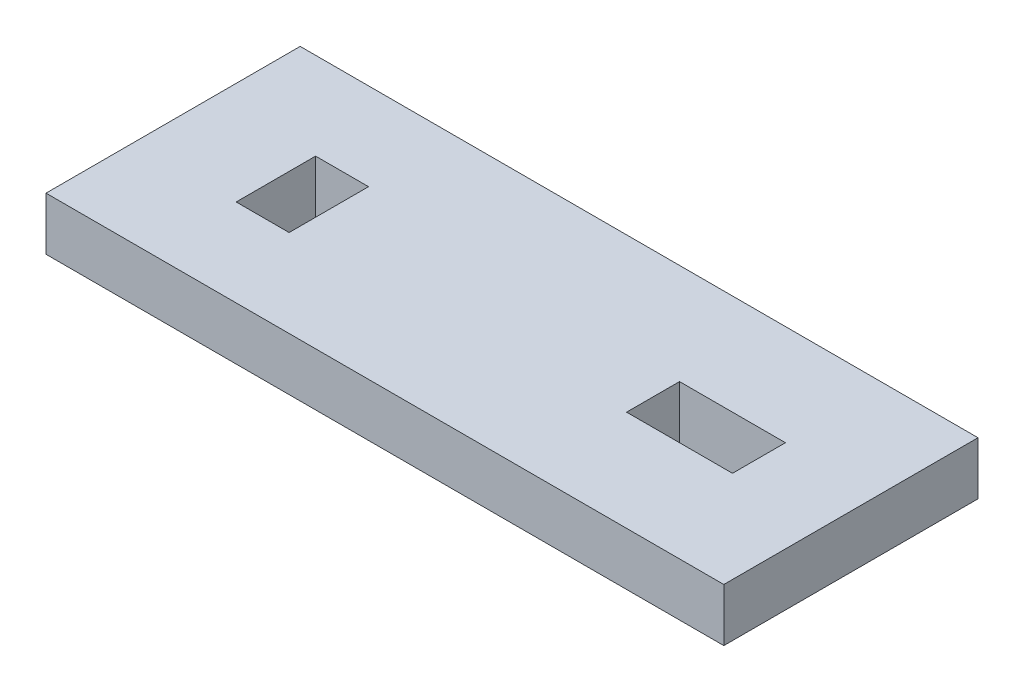
ISO-10303-21;
HEADER;
FILE_DESCRIPTION(('STEP AP214'),'2;1');
FILE_NAME('part.step','',(''),(''),'','','');
FILE_SCHEMA(('AUTOMOTIVE_DESIGN { 1 0 10303 214 1 1 1 1 }'));
ENDSEC;
DATA;
#1=APPLICATION_CONTEXT('core data for automotive mechanical design processes');
#2=APPLICATION_PROTOCOL_DEFINITION('international standard','automotive_design',2000,#1);
#3=PRODUCT_CONTEXT('',#1,'mechanical');
#4=PRODUCT('Part','Part','',(#3));
#5=PRODUCT_RELATED_PRODUCT_CATEGORY('part','',(#4));
#6=PRODUCT_DEFINITION_FORMATION('','',#4);
#7=PRODUCT_DEFINITION_CONTEXT('part definition',#1,'design');
#8=PRODUCT_DEFINITION('design','',#6,#7);
#9=PRODUCT_DEFINITION_SHAPE('','',#8);
#10=(LENGTH_UNIT() NAMED_UNIT(*) SI_UNIT(.MILLI.,.METRE.));
#11=(NAMED_UNIT(*) PLANE_ANGLE_UNIT() SI_UNIT($,.RADIAN.));
#12=(NAMED_UNIT(*) SI_UNIT($,.STERADIAN.) SOLID_ANGLE_UNIT());
#13=UNCERTAINTY_MEASURE_WITH_UNIT(LENGTH_MEASURE(1.E-05),#10,'distance_accuracy_value','');
#14=(GEOMETRIC_REPRESENTATION_CONTEXT(3) GLOBAL_UNCERTAINTY_ASSIGNED_CONTEXT((#13)) GLOBAL_UNIT_ASSIGNED_CONTEXT((#10,
#11,#12)) REPRESENTATION_CONTEXT('',''));
#15=CARTESIAN_POINT('',(0.,0.,0.));
#16=DIRECTION('',(0.,0.,1.));
#17=DIRECTION('',(1.,0.,0.));
#18=AXIS2_PLACEMENT_3D('',#15,#16,#17);
#19=CARTESIAN_POINT('',(0.,3.175,0.));
#20=DIRECTION('',(1.,0.,0.));
#21=DIRECTION('',(0.,0.,-1.));
#22=AXIS2_PLACEMENT_3D('',#19,#20,#21);
#23=PLANE('',#22);
#24=DIRECTION('',(0.,0.,1.));
#25=VECTOR('',#24,1.);
#26=CARTESIAN_POINT('',(0.,0.,0.));
#27=LINE('',#26,#25);
#28=CARTESIAN_POINT('',(0.,0.,-15.24));
#29=VERTEX_POINT('',#28);
#30=CARTESIAN_POINT('',(0.,0.,0.));
#31=VERTEX_POINT('',#30);
#32=EDGE_CURVE('E175',#29,#31,#27,.T.);
#33=ORIENTED_EDGE('',*,*,#32,.T.);
#34=DIRECTION('',(0.,-1.,0.));
#35=VECTOR('',#34,1.);
#36=CARTESIAN_POINT('',(0.,3.175,0.));
#37=LINE('',#36,#35);
#38=CARTESIAN_POINT('',(0.,3.175,0.));
#39=VERTEX_POINT('',#38);
#40=EDGE_CURVE('E11',#39,#31,#37,.T.);
#41=ORIENTED_EDGE('',*,*,#40,.F.);
#42=DIRECTION('',(0.,0.,1.));
#43=VECTOR('',#42,1.);
#44=CARTESIAN_POINT('',(0.,3.175,0.));
#45=LINE('',#44,#43);
#46=CARTESIAN_POINT('',(0.,3.175,-15.24));
#47=VERTEX_POINT('',#46);
#48=EDGE_CURVE('E222',#47,#39,#45,.T.);
#49=ORIENTED_EDGE('',*,*,#48,.F.);
#50=DIRECTION('',(0.,-1.,0.));
#51=VECTOR('',#50,1.);
#52=CARTESIAN_POINT('',(0.,3.175,-15.24));
#53=LINE('',#52,#51);
#54=EDGE_CURVE('E236',#47,#29,#53,.T.);
#55=ORIENTED_EDGE('',*,*,#54,.T.);
#56=EDGE_LOOP('',(#33,#41,#49,#55));
#57=FACE_BOUND('',#56,.T.);
#58=ADVANCED_FACE('F39',(#57),#23,.F.);
#59=CARTESIAN_POINT('',(0.,3.175,0.));
#60=DIRECTION('',(0.,0.,-1.));
#61=DIRECTION('',(-1.,0.,0.));
#62=AXIS2_PLACEMENT_3D('',#59,#60,#61);
#63=PLANE('',#62);
#64=DIRECTION('',(1.,0.,0.));
#65=VECTOR('',#64,1.);
#66=CARTESIAN_POINT('',(0.,0.,0.));
#67=LINE('',#66,#65);
#68=CARTESIAN_POINT('',(40.64,0.,0.));
#69=VERTEX_POINT('',#68);
#70=EDGE_CURVE('E240',#31,#69,#67,.T.);
#71=ORIENTED_EDGE('',*,*,#70,.T.);
#72=DIRECTION('',(0.,-1.,0.));
#73=VECTOR('',#72,1.);
#74=CARTESIAN_POINT('',(40.64,3.175,0.));
#75=LINE('',#74,#73);
#76=CARTESIAN_POINT('',(40.64,3.175,0.));
#77=VERTEX_POINT('',#76);
#78=EDGE_CURVE('E47',#77,#69,#75,.T.);
#79=ORIENTED_EDGE('',*,*,#78,.F.);
#80=DIRECTION('',(1.,0.,0.));
#81=VECTOR('',#80,1.);
#82=CARTESIAN_POINT('',(0.,3.175,0.));
#83=LINE('',#82,#81);
#84=EDGE_CURVE('E226',#39,#77,#83,.T.);
#85=ORIENTED_EDGE('',*,*,#84,.F.);
#86=ORIENTED_EDGE('',*,*,#40,.T.);
#87=EDGE_LOOP('',(#71,#79,#85,#86));
#88=FACE_BOUND('',#87,.T.);
#89=ADVANCED_FACE('F275',(#88),#63,.F.);
#90=CARTESIAN_POINT('',(40.64,3.175,0.));
#91=DIRECTION('',(-1.,0.,0.));
#92=DIRECTION('',(0.,0.,1.));
#93=AXIS2_PLACEMENT_3D('',#90,#91,#92);
#94=PLANE('',#93);
#95=DIRECTION('',(0.,0.,-1.));
#96=VECTOR('',#95,1.);
#97=CARTESIAN_POINT('',(40.64,0.,0.));
#98=LINE('',#97,#96);
#99=CARTESIAN_POINT('',(40.64,0.,-15.24));
#100=VERTEX_POINT('',#99);
#101=EDGE_CURVE('E243',#69,#100,#98,.T.);
#102=ORIENTED_EDGE('',*,*,#101,.T.);
#103=DIRECTION('',(0.,-1.,0.));
#104=VECTOR('',#103,1.);
#105=CARTESIAN_POINT('',(40.64,3.175,-15.24));
#106=LINE('',#105,#104);
#107=CARTESIAN_POINT('',(40.64,3.175,-15.24));
#108=VERTEX_POINT('',#107);
#109=EDGE_CURVE('E251',#108,#100,#106,.T.);
#110=ORIENTED_EDGE('',*,*,#109,.F.);
#111=DIRECTION('',(0.,0.,-1.));
#112=VECTOR('',#111,1.);
#113=CARTESIAN_POINT('',(40.64,3.175,0.));
#114=LINE('',#113,#112);
#115=EDGE_CURVE('E230',#77,#108,#114,.T.);
#116=ORIENTED_EDGE('',*,*,#115,.F.);
#117=ORIENTED_EDGE('',*,*,#78,.T.);
#118=EDGE_LOOP('',(#102,#110,#116,#117));
#119=FACE_BOUND('',#118,.T.);
#120=ADVANCED_FACE('F260',(#119),#94,.F.);
#121=CARTESIAN_POINT('',(0.,3.175,-15.24));
#122=DIRECTION('',(0.,0.,1.));
#123=DIRECTION('',(1.,0.,0.));
#124=AXIS2_PLACEMENT_3D('',#121,#122,#123);
#125=PLANE('',#124);
#126=DIRECTION('',(-1.,0.,0.));
#127=VECTOR('',#126,1.);
#128=CARTESIAN_POINT('',(0.,0.,-15.24));
#129=LINE('',#128,#127);
#130=EDGE_CURVE('E227',#100,#29,#129,.T.);
#131=ORIENTED_EDGE('',*,*,#130,.T.);
#132=ORIENTED_EDGE('',*,*,#54,.F.);
#133=DIRECTION('',(-1.,0.,0.));
#134=VECTOR('',#133,1.);
#135=CARTESIAN_POINT('',(0.,3.175,-15.24));
#136=LINE('',#135,#134);
#137=EDGE_CURVE('E233',#108,#47,#136,.T.);
#138=ORIENTED_EDGE('',*,*,#137,.F.);
#139=ORIENTED_EDGE('',*,*,#109,.T.);
#140=EDGE_LOOP('',(#131,#132,#138,#139));
#141=FACE_BOUND('',#140,.T.);
#142=ADVANCED_FACE('F268',(#141),#125,.F.);
#143=CARTESIAN_POINT('',(0.,3.175,0.));
#144=DIRECTION('',(0.,-1.,0.));
#145=DIRECTION('',(0.,0.,-1.));
#146=AXIS2_PLACEMENT_3D('',#143,#144,#145);
#147=PLANE('',#146);
#148=DIRECTION('',(1.,0.,0.));
#149=VECTOR('',#148,1.);
#150=CARTESIAN_POINT('',(28.7769716442007,3.175,-6.03250000000001));
#151=LINE('',#150,#149);
#152=CARTESIAN_POINT('',(28.7769716442007,3.175,-6.03250000000001));
#153=VERTEX_POINT('',#152);
#154=CARTESIAN_POINT('',(35.1269716442006,3.175,-6.0325));
#155=VERTEX_POINT('',#154);
#156=EDGE_CURVE('E165',#153,#155,#151,.T.);
#157=ORIENTED_EDGE('',*,*,#156,.F.);
#158=DIRECTION('',(0.,0.,1.));
#159=VECTOR('',#158,1.);
#160=CARTESIAN_POINT('',(28.7769716442007,3.175,-9.2075));
#161=LINE('',#160,#159);
#162=CARTESIAN_POINT('',(28.7769716442007,3.175,-9.2075));
#163=VERTEX_POINT('',#162);
#164=EDGE_CURVE('E54',#163,#153,#161,.T.);
#165=ORIENTED_EDGE('',*,*,#164,.F.);
#166=DIRECTION('',(-1.,0.,0.));
#167=VECTOR('',#166,1.);
#168=CARTESIAN_POINT('',(35.1269716442006,3.175,-9.2075));
#169=LINE('',#168,#167);
#170=CARTESIAN_POINT('',(35.1269716442006,3.175,-9.2075));
#171=VERTEX_POINT('',#170);
#172=EDGE_CURVE('E152',#171,#163,#169,.T.);
#173=ORIENTED_EDGE('',*,*,#172,.F.);
#174=DIRECTION('',(0.,0.,-1.));
#175=VECTOR('',#174,1.);
#176=CARTESIAN_POINT('',(35.1269716442006,3.175,-6.0325));
#177=LINE('',#176,#175);
#178=EDGE_CURVE('E156',#155,#171,#177,.T.);
#179=ORIENTED_EDGE('',*,*,#178,.F.);
#180=EDGE_LOOP('',(#157,#165,#173,#179));
#181=FACE_BOUND('',#180,.T.);
#182=DIRECTION('',(0.,0.,1.));
#183=VECTOR('',#182,1.);
#184=CARTESIAN_POINT('',(6.15950000000021,3.175,-10.0046686760881));
#185=LINE('',#184,#183);
#186=CARTESIAN_POINT('',(6.15950000000021,3.175,-10.0046686760881));
#187=VERTEX_POINT('',#186);
#188=CARTESIAN_POINT('',(6.15950000000037,3.175,-5.24216867608814));
#189=VERTEX_POINT('',#188);
#190=EDGE_CURVE('E201',#187,#189,#185,.T.);
#191=ORIENTED_EDGE('',*,*,#190,.F.);
#192=DIRECTION('',(-1.,0.,0.));
#193=VECTOR('',#192,1.);
#194=CARTESIAN_POINT('',(9.33450000000013,3.175,-10.0046686760881));
#195=LINE('',#194,#193);
#196=CARTESIAN_POINT('',(9.33450000000013,3.175,-10.0046686760881));
#197=VERTEX_POINT('',#196);
#198=EDGE_CURVE('E62',#197,#187,#195,.T.);
#199=ORIENTED_EDGE('',*,*,#198,.F.);
#200=DIRECTION('',(0.,0.,-1.));
#201=VECTOR('',#200,1.);
#202=CARTESIAN_POINT('',(9.33450000000013,3.175,-5.24216867608815));
#203=LINE('',#202,#201);
#204=CARTESIAN_POINT('',(9.33450000000013,3.175,-5.24216867608815));
#205=VERTEX_POINT('',#204);
#206=EDGE_CURVE('E186',#205,#197,#203,.T.);
#207=ORIENTED_EDGE('',*,*,#206,.F.);
#208=DIRECTION('',(1.,0.,0.));
#209=VECTOR('',#208,1.);
#210=CARTESIAN_POINT('',(6.15950000000037,3.175,-5.24216867608814));
#211=LINE('',#210,#209);
#212=EDGE_CURVE('E205',#189,#205,#211,.T.);
#213=ORIENTED_EDGE('',*,*,#212,.F.);
#214=EDGE_LOOP('',(#191,#199,#207,#213));
#215=FACE_BOUND('',#214,.T.);
#216=ORIENTED_EDGE('',*,*,#48,.T.);
#217=ORIENTED_EDGE('',*,*,#84,.T.);
#218=ORIENTED_EDGE('',*,*,#115,.T.);
#219=ORIENTED_EDGE('',*,*,#137,.T.);
#220=EDGE_LOOP('',(#216,#217,#218,#219));
#221=FACE_BOUND('',#220,.T.);
#222=ADVANCED_FACE('F274',(#181,#215,#221),#147,.F.);
#223=CARTESIAN_POINT('',(0.,0.,0.));
#224=DIRECTION('',(0.,-1.,0.));
#225=DIRECTION('',(0.,0.,-1.));
#226=AXIS2_PLACEMENT_3D('',#223,#224,#225);
#227=PLANE('',#226);
#228=DIRECTION('',(0.,0.,1.));
#229=VECTOR('',#228,1.);
#230=CARTESIAN_POINT('',(28.7769716442007,0.,-9.2075));
#231=LINE('',#230,#229);
#232=CARTESIAN_POINT('',(28.7769716442007,0.,-9.2075));
#233=VERTEX_POINT('',#232);
#234=CARTESIAN_POINT('',(28.7769716442007,0.,-6.03250000000001));
#235=VERTEX_POINT('',#234);
#236=EDGE_CURVE('E130',#233,#235,#231,.T.);
#237=ORIENTED_EDGE('',*,*,#236,.T.);
#238=DIRECTION('',(1.,0.,0.));
#239=VECTOR('',#238,1.);
#240=CARTESIAN_POINT('',(28.7769716442007,0.,-6.03250000000001));
#241=LINE('',#240,#239);
#242=CARTESIAN_POINT('',(35.1269716442006,0.,-6.0325));
#243=VERTEX_POINT('',#242);
#244=EDGE_CURVE('E141',#235,#243,#241,.T.);
#245=ORIENTED_EDGE('',*,*,#244,.T.);
#246=DIRECTION('',(0.,0.,-1.));
#247=VECTOR('',#246,1.);
#248=CARTESIAN_POINT('',(35.1269716442006,0.,-6.0325));
#249=LINE('',#248,#247);
#250=CARTESIAN_POINT('',(35.1269716442006,0.,-9.2075));
#251=VERTEX_POINT('',#250);
#252=EDGE_CURVE('E146',#243,#251,#249,.T.);
#253=ORIENTED_EDGE('',*,*,#252,.T.);
#254=DIRECTION('',(-1.,0.,0.));
#255=VECTOR('',#254,1.);
#256=CARTESIAN_POINT('',(35.1269716442006,0.,-9.2075));
#257=LINE('',#256,#255);
#258=EDGE_CURVE('E137',#251,#233,#257,.T.);
#259=ORIENTED_EDGE('',*,*,#258,.T.);
#260=EDGE_LOOP('',(#237,#245,#253,#259));
#261=FACE_BOUND('',#260,.T.);
#262=DIRECTION('',(-1.,0.,0.));
#263=VECTOR('',#262,1.);
#264=CARTESIAN_POINT('',(9.33450000000013,0.,-10.0046686760881));
#265=LINE('',#264,#263);
#266=CARTESIAN_POINT('',(9.33450000000013,0.,-10.0046686760881));
#267=VERTEX_POINT('',#266);
#268=CARTESIAN_POINT('',(6.15950000000021,0.,-10.0046686760881));
#269=VERTEX_POINT('',#268);
#270=EDGE_CURVE('E181',#267,#269,#265,.T.);
#271=ORIENTED_EDGE('',*,*,#270,.T.);
#272=DIRECTION('',(0.,0.,1.));
#273=VECTOR('',#272,1.);
#274=CARTESIAN_POINT('',(6.15950000000021,0.,-10.0046686760881));
#275=LINE('',#274,#273);
#276=CARTESIAN_POINT('',(6.15950000000037,0.,-5.24216867608814));
#277=VERTEX_POINT('',#276);
#278=EDGE_CURVE('E185',#269,#277,#275,.T.);
#279=ORIENTED_EDGE('',*,*,#278,.T.);
#280=DIRECTION('',(1.,0.,0.));
#281=VECTOR('',#280,1.);
#282=CARTESIAN_POINT('',(6.15950000000037,0.,-5.24216867608814));
#283=LINE('',#282,#281);
#284=CARTESIAN_POINT('',(9.33450000000013,0.,-5.24216867608815));
#285=VERTEX_POINT('',#284);
#286=EDGE_CURVE('E190',#277,#285,#283,.T.);
#287=ORIENTED_EDGE('',*,*,#286,.T.);
#288=DIRECTION('',(0.,0.,-1.));
#289=VECTOR('',#288,1.);
#290=CARTESIAN_POINT('',(9.33450000000013,0.,-5.24216867608815));
#291=LINE('',#290,#289);
#292=EDGE_CURVE('E194',#285,#267,#291,.T.);
#293=ORIENTED_EDGE('',*,*,#292,.T.);
#294=EDGE_LOOP('',(#271,#279,#287,#293));
#295=FACE_BOUND('',#294,.T.);
#296=ORIENTED_EDGE('',*,*,#32,.F.);
#297=ORIENTED_EDGE('',*,*,#130,.F.);
#298=ORIENTED_EDGE('',*,*,#101,.F.);
#299=ORIENTED_EDGE('',*,*,#70,.F.);
#300=EDGE_LOOP('',(#296,#297,#298,#299));
#301=FACE_BOUND('',#300,.T.);
#302=ADVANCED_FACE('F148',(#261,#295,#301),#227,.T.);
#303=CARTESIAN_POINT('',(9.33450000000013,0.,-10.0046686760881));
#304=DIRECTION('',(0.,0.,-1.));
#305=DIRECTION('',(-1.,0.,0.));
#306=AXIS2_PLACEMENT_3D('',#303,#304,#305);
#307=PLANE('',#306);
#308=ORIENTED_EDGE('',*,*,#198,.T.);
#309=DIRECTION('',(0.,1.,0.));
#310=VECTOR('',#309,1.);
#311=CARTESIAN_POINT('',(6.15950000000021,0.,-10.0046686760881));
#312=LINE('',#311,#310);
#313=EDGE_CURVE('E198',#269,#187,#312,.T.);
#314=ORIENTED_EDGE('',*,*,#313,.F.);
#315=ORIENTED_EDGE('',*,*,#270,.F.);
#316=DIRECTION('',(0.,1.,0.));
#317=VECTOR('',#316,1.);
#318=CARTESIAN_POINT('',(9.33450000000013,0.,-10.0046686760881));
#319=LINE('',#318,#317);
#320=EDGE_CURVE('E166',#267,#197,#319,.T.);
#321=ORIENTED_EDGE('',*,*,#320,.T.);
#322=EDGE_LOOP('',(#308,#314,#315,#321));
#323=FACE_BOUND('',#322,.T.);
#324=ADVANCED_FACE('F287',(#323),#307,.F.);
#325=CARTESIAN_POINT('',(9.33450000000013,0.,-5.24216867608815));
#326=DIRECTION('',(1.,0.,0.));
#327=DIRECTION('',(0.,0.,-1.));
#328=AXIS2_PLACEMENT_3D('',#325,#326,#327);
#329=PLANE('',#328);
#330=ORIENTED_EDGE('',*,*,#206,.T.);
#331=ORIENTED_EDGE('',*,*,#320,.F.);
#332=ORIENTED_EDGE('',*,*,#292,.F.);
#333=DIRECTION('',(0.,1.,0.));
#334=VECTOR('',#333,1.);
#335=CARTESIAN_POINT('',(9.33450000000013,0.,-5.24216867608815));
#336=LINE('',#335,#334);
#337=EDGE_CURVE('E214',#285,#205,#336,.T.);
#338=ORIENTED_EDGE('',*,*,#337,.T.);
#339=EDGE_LOOP('',(#330,#331,#332,#338));
#340=FACE_BOUND('',#339,.T.);
#341=ADVANCED_FACE('F293',(#340),#329,.F.);
#342=CARTESIAN_POINT('',(6.15950000000037,0.,-5.24216867608814));
#343=DIRECTION('',(0.,0.,1.));
#344=DIRECTION('',(1.,0.,0.));
#345=AXIS2_PLACEMENT_3D('',#342,#343,#344);
#346=PLANE('',#345);
#347=ORIENTED_EDGE('',*,*,#212,.T.);
#348=ORIENTED_EDGE('',*,*,#337,.F.);
#349=ORIENTED_EDGE('',*,*,#286,.F.);
#350=DIRECTION('',(0.,1.,0.));
#351=VECTOR('',#350,1.);
#352=CARTESIAN_POINT('',(6.15950000000037,0.,-5.24216867608814));
#353=LINE('',#352,#351);
#354=EDGE_CURVE('E217',#277,#189,#353,.T.);
#355=ORIENTED_EDGE('',*,*,#354,.T.);
#356=EDGE_LOOP('',(#347,#348,#349,#355));
#357=FACE_BOUND('',#356,.T.);
#358=ADVANCED_FACE('F297',(#357),#346,.F.);
#359=CARTESIAN_POINT('',(6.15950000000021,0.,-10.0046686760881));
#360=DIRECTION('',(-1.,0.,0.));
#361=DIRECTION('',(0.,0.,1.));
#362=AXIS2_PLACEMENT_3D('',#359,#360,#361);
#363=PLANE('',#362);
#364=ORIENTED_EDGE('',*,*,#190,.T.);
#365=ORIENTED_EDGE('',*,*,#354,.F.);
#366=ORIENTED_EDGE('',*,*,#278,.F.);
#367=ORIENTED_EDGE('',*,*,#313,.T.);
#368=EDGE_LOOP('',(#364,#365,#366,#367));
#369=FACE_BOUND('',#368,.T.);
#370=ADVANCED_FACE('F294',(#369),#363,.F.);
#371=CARTESIAN_POINT('',(28.7769716442007,0.,-9.2075));
#372=DIRECTION('',(-1.,0.,0.));
#373=DIRECTION('',(0.,0.,1.));
#374=AXIS2_PLACEMENT_3D('',#371,#372,#373);
#375=PLANE('',#374);
#376=ORIENTED_EDGE('',*,*,#164,.T.);
#377=DIRECTION('',(0.,1.,0.));
#378=VECTOR('',#377,1.);
#379=CARTESIAN_POINT('',(28.7769716442007,0.,-6.03250000000001));
#380=LINE('',#379,#378);
#381=EDGE_CURVE('E126',#235,#153,#380,.T.);
#382=ORIENTED_EDGE('',*,*,#381,.F.);
#383=ORIENTED_EDGE('',*,*,#236,.F.);
#384=DIRECTION('',(0.,1.,0.));
#385=VECTOR('',#384,1.);
#386=CARTESIAN_POINT('',(28.7769716442007,0.,-9.2075));
#387=LINE('',#386,#385);
#388=EDGE_CURVE('E172',#233,#163,#387,.T.);
#389=ORIENTED_EDGE('',*,*,#388,.T.);
#390=EDGE_LOOP('',(#376,#382,#383,#389));
#391=FACE_BOUND('',#390,.T.);
#392=ADVANCED_FACE('F128',(#391),#375,.F.);
#393=CARTESIAN_POINT('',(35.1269716442006,0.,-9.2075));
#394=DIRECTION('',(0.,0.,-1.));
#395=DIRECTION('',(-1.,0.,0.));
#396=AXIS2_PLACEMENT_3D('',#393,#394,#395);
#397=PLANE('',#396);
#398=ORIENTED_EDGE('',*,*,#172,.T.);
#399=ORIENTED_EDGE('',*,*,#388,.F.);
#400=ORIENTED_EDGE('',*,*,#258,.F.);
#401=DIRECTION('',(0.,1.,0.));
#402=VECTOR('',#401,1.);
#403=CARTESIAN_POINT('',(35.1269716442006,0.,-9.2075));
#404=LINE('',#403,#402);
#405=EDGE_CURVE('E176',#251,#171,#404,.T.);
#406=ORIENTED_EDGE('',*,*,#405,.T.);
#407=EDGE_LOOP('',(#398,#399,#400,#406));
#408=FACE_BOUND('',#407,.T.);
#409=ADVANCED_FACE('F307',(#408),#397,.F.);
#410=CARTESIAN_POINT('',(35.1269716442006,0.,-6.0325));
#411=DIRECTION('',(1.,0.,0.));
#412=DIRECTION('',(0.,0.,-1.));
#413=AXIS2_PLACEMENT_3D('',#410,#411,#412);
#414=PLANE('',#413);
#415=ORIENTED_EDGE('',*,*,#178,.T.);
#416=ORIENTED_EDGE('',*,*,#405,.F.);
#417=ORIENTED_EDGE('',*,*,#252,.F.);
#418=DIRECTION('',(0.,1.,0.));
#419=VECTOR('',#418,1.);
#420=CARTESIAN_POINT('',(35.1269716442006,0.,-6.0325));
#421=LINE('',#420,#419);
#422=EDGE_CURVE('E136',#243,#155,#421,.T.);
#423=ORIENTED_EDGE('',*,*,#422,.T.);
#424=EDGE_LOOP('',(#415,#416,#417,#423));
#425=FACE_BOUND('',#424,.T.);
#426=ADVANCED_FACE('F310',(#425),#414,.F.);
#427=CARTESIAN_POINT('',(28.7769716442007,0.,-6.03250000000001));
#428=DIRECTION('',(0.,0.,1.));
#429=DIRECTION('',(1.,0.,0.));
#430=AXIS2_PLACEMENT_3D('',#427,#428,#429);
#431=PLANE('',#430);
#432=ORIENTED_EDGE('',*,*,#156,.T.);
#433=ORIENTED_EDGE('',*,*,#422,.F.);
#434=ORIENTED_EDGE('',*,*,#244,.F.);
#435=ORIENTED_EDGE('',*,*,#381,.T.);
#436=EDGE_LOOP('',(#432,#433,#434,#435));
#437=FACE_BOUND('',#436,.T.);
#438=ADVANCED_FACE('F142',(#437),#431,.F.);
#439=CLOSED_SHELL('',(#58,#89,#120,#142,#222,#302,#324,#341,#358,#370,#392,#409,#426,#438));
#440=MANIFOLD_SOLID_BREP('B2',#439);
#441=ADVANCED_BREP_SHAPE_REPRESENTATION('',(#18,#440),#14);
#442=SHAPE_DEFINITION_REPRESENTATION(#9,#441);
ENDSEC;
END-ISO-10303-21;
